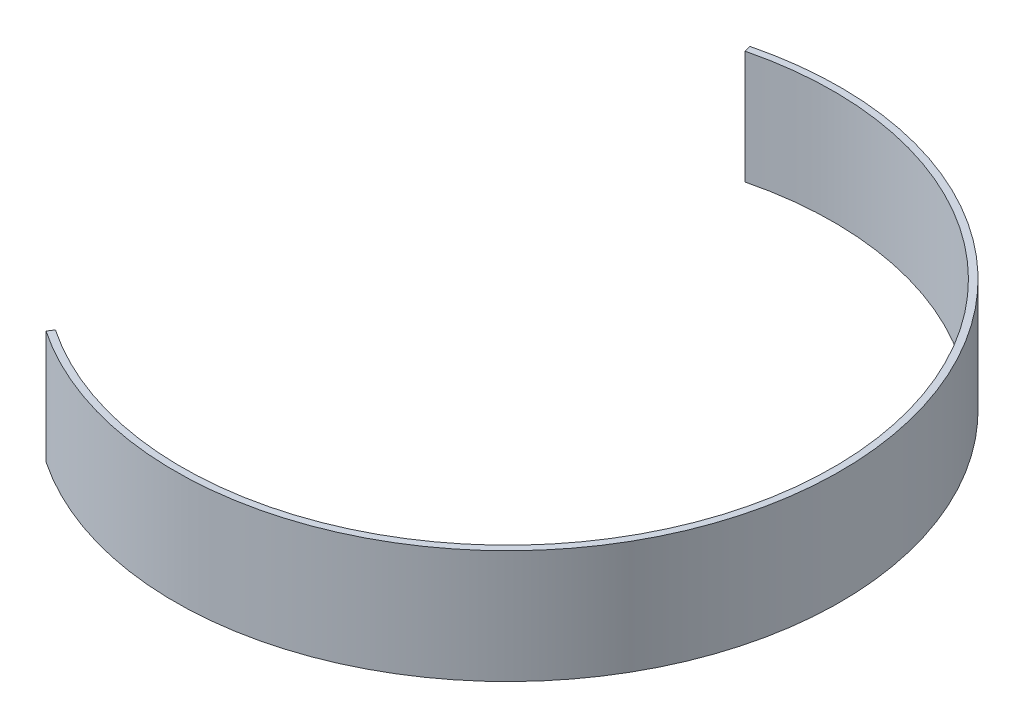
ISO-10303-21;
HEADER;
FILE_DESCRIPTION(('STEP AP214'),'2;1');
FILE_NAME('part.step','',(''),(''),'','','');
FILE_SCHEMA(('AUTOMOTIVE_DESIGN { 1 0 10303 214 1 1 1 1 }'));
ENDSEC;
DATA;
#1=APPLICATION_CONTEXT('core data for automotive mechanical design processes');
#2=APPLICATION_PROTOCOL_DEFINITION('international standard','automotive_design',2000,#1);
#3=PRODUCT_CONTEXT('',#1,'mechanical');
#4=PRODUCT('Part','Part','',(#3));
#5=PRODUCT_RELATED_PRODUCT_CATEGORY('part','',(#4));
#6=PRODUCT_DEFINITION_FORMATION('','',#4);
#7=PRODUCT_DEFINITION_CONTEXT('part definition',#1,'design');
#8=PRODUCT_DEFINITION('design','',#6,#7);
#9=PRODUCT_DEFINITION_SHAPE('','',#8);
#10=(LENGTH_UNIT() NAMED_UNIT(*) SI_UNIT(.MILLI.,.METRE.));
#11=(NAMED_UNIT(*) PLANE_ANGLE_UNIT() SI_UNIT($,.RADIAN.));
#12=(NAMED_UNIT(*) SI_UNIT($,.STERADIAN.) SOLID_ANGLE_UNIT());
#13=UNCERTAINTY_MEASURE_WITH_UNIT(LENGTH_MEASURE(1.E-05),#10,'distance_accuracy_value','');
#14=(GEOMETRIC_REPRESENTATION_CONTEXT(3) GLOBAL_UNCERTAINTY_ASSIGNED_CONTEXT((#13)) GLOBAL_UNIT_ASSIGNED_CONTEXT((#10,
#11,#12)) REPRESENTATION_CONTEXT('',''));
#15=CARTESIAN_POINT('',(0.,0.,0.));
#16=DIRECTION('',(0.,0.,1.));
#17=DIRECTION('',(1.,0.,0.));
#18=AXIS2_PLACEMENT_3D('',#15,#16,#17);
#19=CARTESIAN_POINT('',(-32.1535919495676,20.,47.6696604219151));
#20=DIRECTION('',(0.829037572555053,0.,0.559192903470731));
#21=DIRECTION('',(0.559192903470731,0.,-0.829037572555053));
#22=AXIS2_PLACEMENT_3D('',#19,#20,#21);
#23=PLANE('',#22);
#24=DIRECTION('',(-0.559192903470731,0.,0.829037572555053));
#25=VECTOR('',#24,1.);
#26=CARTESIAN_POINT('',(-32.1535919495676,0.,47.6696604219151));
#27=LINE('',#26,#25);
#28=CARTESIAN_POINT('',(-32.1535919495676,0.,47.6696604219151));
#29=VERTEX_POINT('',#28);
#30=CARTESIAN_POINT('',(-32.8246234337325,0.,48.6645055089812));
#31=VERTEX_POINT('',#30);
#32=EDGE_CURVE('E97',#29,#31,#27,.T.);
#33=ORIENTED_EDGE('',*,*,#32,.T.);
#34=DIRECTION('',(0.,-1.,0.));
#35=VECTOR('',#34,1.);
#36=CARTESIAN_POINT('',(-32.8246234337325,20.,48.6645055089812));
#37=LINE('',#36,#35);
#38=CARTESIAN_POINT('',(-32.8246234337325,20.,48.6645055089812));
#39=VERTEX_POINT('',#38);
#40=EDGE_CURVE('E11',#39,#31,#37,.T.);
#41=ORIENTED_EDGE('',*,*,#40,.F.);
#42=DIRECTION('',(-0.559192903470731,0.,0.829037572555053));
#43=VECTOR('',#42,1.);
#44=CARTESIAN_POINT('',(-32.1535919495676,20.,47.6696604219151));
#45=LINE('',#44,#43);
#46=CARTESIAN_POINT('',(-32.1535919495676,20.,47.6696604219151));
#47=VERTEX_POINT('',#46);
#48=EDGE_CURVE('E83',#47,#39,#45,.T.);
#49=ORIENTED_EDGE('',*,*,#48,.F.);
#50=DIRECTION('',(0.,-1.,0.));
#51=VECTOR('',#50,1.);
#52=CARTESIAN_POINT('',(-32.1535919495676,20.,47.6696604219151));
#53=LINE('',#52,#51);
#54=EDGE_CURVE('E50',#47,#29,#53,.T.);
#55=ORIENTED_EDGE('',*,*,#54,.T.);
#56=EDGE_LOOP('',(#33,#41,#49,#55));
#57=FACE_BOUND('',#56,.T.);
#58=ADVANCED_FACE('F34',(#57),#23,.F.);
#59=CARTESIAN_POINT('',(0.,20.,0.));
#60=DIRECTION('',(0.,-1.,0.));
#61=DIRECTION('',(0.,0.,-1.));
#62=AXIS2_PLACEMENT_3D('',#59,#60,#61);
#63=CYLINDRICAL_SURFACE('',#62,58.7);
#64=CARTESIAN_POINT('',(0.,0.,0.));
#65=DIRECTION('',(0.,1.,0.));
#66=DIRECTION('',(0.,0.,1.));
#67=AXIS2_PLACEMENT_3D('',#64,#65,#66);
#68=CIRCLE('',#67,58.7);
#69=CARTESIAN_POINT('',(-14.2008152717001,0.,-56.9563591324011));
#70=VERTEX_POINT('',#69);
#71=EDGE_CURVE('E88',#31,#70,#68,.T.);
#72=ORIENTED_EDGE('',*,*,#71,.T.);
#73=DIRECTION('',(0.,-1.,0.));
#74=VECTOR('',#73,1.);
#75=CARTESIAN_POINT('',(-14.2008152717001,20.,-56.9563591324011));
#76=LINE('',#75,#74);
#77=CARTESIAN_POINT('',(-14.2008152717001,20.,-56.9563591324011));
#78=VERTEX_POINT('',#77);
#79=EDGE_CURVE('E42',#78,#70,#76,.T.);
#80=ORIENTED_EDGE('',*,*,#79,.F.);
#81=CARTESIAN_POINT('',(0.,20.,0.));
#82=DIRECTION('',(0.,1.,0.));
#83=DIRECTION('',(0.,0.,1.));
#84=AXIS2_PLACEMENT_3D('',#81,#82,#83);
#85=CIRCLE('',#84,58.7);
#86=EDGE_CURVE('E76',#39,#78,#85,.T.);
#87=ORIENTED_EDGE('',*,*,#86,.F.);
#88=ORIENTED_EDGE('',*,*,#40,.T.);
#89=EDGE_LOOP('',(#72,#80,#87,#88));
#90=FACE_BOUND('',#89,.T.);
#91=ADVANCED_FACE('F87',(#90),#63,.T.);
#92=CARTESIAN_POINT('',(-14.2008152717001,20.,-56.9563591324011));
#93=DIRECTION('',(0.970295726276001,0.,-0.241921895599648));
#94=DIRECTION('',(-0.241921895599648,0.,-0.970295726276001));
#95=AXIS2_PLACEMENT_3D('',#92,#93,#94);
#96=PLANE('',#95);
#97=DIRECTION('',(0.241921895599648,0.,0.970295726276001));
#98=VECTOR('',#97,1.);
#99=CARTESIAN_POINT('',(-14.2008152717001,0.,-56.9563591324011));
#100=LINE('',#99,#98);
#101=CARTESIAN_POINT('',(-13.9105089969805,0.,-55.7920042608699));
#102=VERTEX_POINT('',#101);
#103=EDGE_CURVE('E100',#70,#102,#100,.T.);
#104=ORIENTED_EDGE('',*,*,#103,.T.);
#105=DIRECTION('',(0.,-1.,0.));
#106=VECTOR('',#105,1.);
#107=CARTESIAN_POINT('',(-13.9105089969805,20.,-55.7920042608699));
#108=LINE('',#107,#106);
#109=CARTESIAN_POINT('',(-13.9105089969805,20.,-55.7920042608699));
#110=VERTEX_POINT('',#109);
#111=EDGE_CURVE('E65',#110,#102,#108,.T.);
#112=ORIENTED_EDGE('',*,*,#111,.F.);
#113=DIRECTION('',(0.241921895599648,0.,0.970295726276001));
#114=VECTOR('',#113,1.);
#115=CARTESIAN_POINT('',(-14.2008152717001,20.,-56.9563591324011));
#116=LINE('',#115,#114);
#117=EDGE_CURVE('E82',#78,#110,#116,.T.);
#118=ORIENTED_EDGE('',*,*,#117,.F.);
#119=ORIENTED_EDGE('',*,*,#79,.T.);
#120=EDGE_LOOP('',(#104,#112,#118,#119));
#121=FACE_BOUND('',#120,.T.);
#122=ADVANCED_FACE('F91',(#121),#96,.F.);
#123=CARTESIAN_POINT('',(0.,20.,0.));
#124=DIRECTION('',(0.,-1.,0.));
#125=DIRECTION('',(0.,0.,-1.));
#126=AXIS2_PLACEMENT_3D('',#123,#124,#125);
#127=CYLINDRICAL_SURFACE('',#126,57.5);
#128=CARTESIAN_POINT('',(0.,0.,0.));
#129=DIRECTION('',(0.,1.,0.));
#130=DIRECTION('',(0.,0.,1.));
#131=AXIS2_PLACEMENT_3D('',#128,#129,#130);
#132=CIRCLE('',#131,57.5);
#133=EDGE_CURVE('E102',#29,#102,#132,.T.);
#134=ORIENTED_EDGE('',*,*,#133,.F.);
#135=ORIENTED_EDGE('',*,*,#54,.F.);
#136=CARTESIAN_POINT('',(0.,20.,0.));
#137=DIRECTION('',(0.,1.,0.));
#138=DIRECTION('',(0.,0.,1.));
#139=AXIS2_PLACEMENT_3D('',#136,#137,#138);
#140=CIRCLE('',#139,57.5);
#141=EDGE_CURVE('E92',#47,#110,#140,.T.);
#142=ORIENTED_EDGE('',*,*,#141,.T.);
#143=ORIENTED_EDGE('',*,*,#111,.T.);
#144=EDGE_LOOP('',(#134,#135,#142,#143));
#145=FACE_BOUND('',#144,.T.);
#146=ADVANCED_FACE('F108',(#145),#127,.F.);
#147=CARTESIAN_POINT('',(0.,20.,0.));
#148=DIRECTION('',(0.,1.,0.));
#149=DIRECTION('',(0.,0.,1.));
#150=AXIS2_PLACEMENT_3D('',#147,#148,#149);
#151=PLANE('',#150);
#152=ORIENTED_EDGE('',*,*,#48,.T.);
#153=ORIENTED_EDGE('',*,*,#86,.T.);
#154=ORIENTED_EDGE('',*,*,#117,.T.);
#155=ORIENTED_EDGE('',*,*,#141,.F.);
#156=EDGE_LOOP('',(#152,#153,#154,#155));
#157=FACE_BOUND('',#156,.T.);
#158=ADVANCED_FACE('F79',(#157),#151,.T.);
#159=CARTESIAN_POINT('',(0.,0.,0.));
#160=DIRECTION('',(0.,1.,0.));
#161=DIRECTION('',(0.,0.,1.));
#162=AXIS2_PLACEMENT_3D('',#159,#160,#161);
#163=PLANE('',#162);
#164=ORIENTED_EDGE('',*,*,#32,.F.);
#165=ORIENTED_EDGE('',*,*,#133,.T.);
#166=ORIENTED_EDGE('',*,*,#103,.F.);
#167=ORIENTED_EDGE('',*,*,#71,.F.);
#168=EDGE_LOOP('',(#164,#165,#166,#167));
#169=FACE_BOUND('',#168,.T.);
#170=ADVANCED_FACE('F107',(#169),#163,.F.);
#171=CLOSED_SHELL('',(#58,#91,#122,#146,#158,#170));
#172=MANIFOLD_SOLID_BREP('B2',#171);
#173=ADVANCED_BREP_SHAPE_REPRESENTATION('',(#18,#172),#14);
#174=SHAPE_DEFINITION_REPRESENTATION(#9,#173);
ENDSEC;
END-ISO-10303-21;
